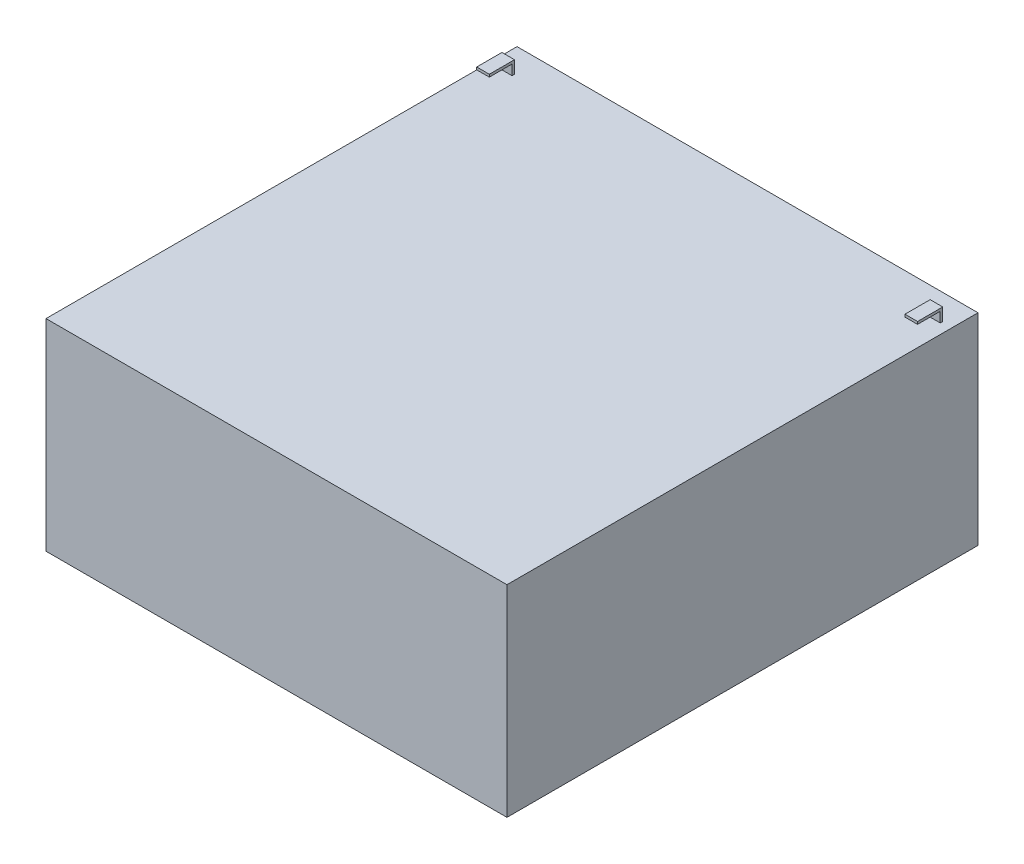
ISO-10303-21;
HEADER;
FILE_DESCRIPTION(('STEP AP214'),'2;1');
FILE_NAME('part.step','',(''),(''),'','','');
FILE_SCHEMA(('AUTOMOTIVE_DESIGN { 1 0 10303 214 1 1 1 1 }'));
ENDSEC;
DATA;
#1=APPLICATION_CONTEXT('core data for automotive mechanical design processes');
#2=APPLICATION_PROTOCOL_DEFINITION('international standard','automotive_design',2000,#1);
#3=PRODUCT_CONTEXT('',#1,'mechanical');
#4=PRODUCT('Part','Part','',(#3));
#5=PRODUCT_RELATED_PRODUCT_CATEGORY('part','',(#4));
#6=PRODUCT_DEFINITION_FORMATION('','',#4);
#7=PRODUCT_DEFINITION_CONTEXT('part definition',#1,'design');
#8=PRODUCT_DEFINITION('design','',#6,#7);
#9=PRODUCT_DEFINITION_SHAPE('','',#8);
#10=(LENGTH_UNIT() NAMED_UNIT(*) SI_UNIT(.MILLI.,.METRE.));
#11=(NAMED_UNIT(*) PLANE_ANGLE_UNIT() SI_UNIT($,.RADIAN.));
#12=(NAMED_UNIT(*) SI_UNIT($,.STERADIAN.) SOLID_ANGLE_UNIT());
#13=UNCERTAINTY_MEASURE_WITH_UNIT(LENGTH_MEASURE(1.E-05),#10,'distance_accuracy_value','');
#14=(GEOMETRIC_REPRESENTATION_CONTEXT(3) GLOBAL_UNCERTAINTY_ASSIGNED_CONTEXT((#13)) GLOBAL_UNIT_ASSIGNED_CONTEXT((#10,
#11,#12)) REPRESENTATION_CONTEXT('',''));
#15=CARTESIAN_POINT('',(0.,0.,0.));
#16=DIRECTION('',(0.,0.,1.));
#17=DIRECTION('',(1.,0.,0.));
#18=AXIS2_PLACEMENT_3D('',#15,#16,#17);
#19=CARTESIAN_POINT('',(0.,80.,-187.));
#20=DIRECTION('',(0.,-1.,0.));
#21=DIRECTION('',(0.,0.,-1.));
#22=AXIS2_PLACEMENT_3D('',#19,#20,#21);
#23=PLANE('',#22);
#24=DIRECTION('',(1.,0.,0.));
#25=VECTOR('',#24,1.);
#26=CARTESIAN_POINT('',(179.,80.,-177.));
#27=LINE('',#26,#25);
#28=CARTESIAN_POINT('',(174.,80.,-177.));
#29=VERTEX_POINT('',#28);
#30=CARTESIAN_POINT('',(179.,80.,-177.));
#31=VERTEX_POINT('',#30);
#32=EDGE_CURVE('E162',#29,#31,#27,.T.);
#33=ORIENTED_EDGE('',*,*,#32,.T.);
#34=DIRECTION('',(0.,0.,1.));
#35=VECTOR('',#34,1.);
#36=CARTESIAN_POINT('',(179.,80.,-177.));
#37=LINE('',#36,#35);
#38=CARTESIAN_POINT('',(179.,80.,-176.));
#39=VERTEX_POINT('',#38);
#40=EDGE_CURVE('E46',#31,#39,#37,.T.);
#41=ORIENTED_EDGE('',*,*,#40,.T.);
#42=DIRECTION('',(-1.,0.,0.));
#43=VECTOR('',#42,1.);
#44=CARTESIAN_POINT('',(179.,80.,-176.));
#45=LINE('',#44,#43);
#46=CARTESIAN_POINT('',(174.,80.,-176.));
#47=VERTEX_POINT('',#46);
#48=EDGE_CURVE('E168',#39,#47,#45,.T.);
#49=ORIENTED_EDGE('',*,*,#48,.T.);
#50=DIRECTION('',(0.,0.,-1.));
#51=VECTOR('',#50,1.);
#52=CARTESIAN_POINT('',(174.,80.,-177.));
#53=LINE('',#52,#51);
#54=EDGE_CURVE('E150',#47,#29,#53,.T.);
#55=ORIENTED_EDGE('',*,*,#54,.T.);
#56=EDGE_LOOP('',(#33,#41,#49,#55));
#57=FACE_BOUND('',#56,.T.);
#58=DIRECTION('',(0.,0.,1.));
#59=VECTOR('',#58,1.);
#60=CARTESIAN_POINT('',(0.,80.,0.));
#61=LINE('',#60,#59);
#62=CARTESIAN_POINT('',(0.,80.,-187.));
#63=VERTEX_POINT('',#62);
#64=CARTESIAN_POINT('',(0.,80.,0.));
#65=VERTEX_POINT('',#64);
#66=EDGE_CURVE('E253',#63,#65,#61,.T.);
#67=ORIENTED_EDGE('',*,*,#66,.T.);
#68=DIRECTION('',(1.,0.,0.));
#69=VECTOR('',#68,1.);
#70=CARTESIAN_POINT('',(0.,80.,0.));
#71=LINE('',#70,#69);
#72=CARTESIAN_POINT('',(183.,80.,0.));
#73=VERTEX_POINT('',#72);
#74=EDGE_CURVE('E256',#65,#73,#71,.T.);
#75=ORIENTED_EDGE('',*,*,#74,.T.);
#76=DIRECTION('',(0.,0.,-1.));
#77=VECTOR('',#76,1.);
#78=CARTESIAN_POINT('',(183.,80.,0.));
#79=LINE('',#78,#77);
#80=CARTESIAN_POINT('',(183.,80.,-187.));
#81=VERTEX_POINT('',#80);
#82=EDGE_CURVE('E258',#73,#81,#79,.T.);
#83=ORIENTED_EDGE('',*,*,#82,.T.);
#84=DIRECTION('',(-1.,0.,0.));
#85=VECTOR('',#84,1.);
#86=CARTESIAN_POINT('',(0.,80.,-187.));
#87=LINE('',#86,#85);
#88=EDGE_CURVE('E260',#81,#63,#87,.T.);
#89=ORIENTED_EDGE('',*,*,#88,.T.);
#90=EDGE_LOOP('',(#67,#75,#83,#89));
#91=FACE_BOUND('',#90,.T.);
#92=DIRECTION('',(-1.,0.,0.));
#93=VECTOR('',#92,1.);
#94=CARTESIAN_POINT('',(4.,80.,-177.));
#95=LINE('',#94,#93);
#96=CARTESIAN_POINT('',(9.,80.,-177.));
#97=VERTEX_POINT('',#96);
#98=CARTESIAN_POINT('',(4.,80.,-177.));
#99=VERTEX_POINT('',#98);
#100=EDGE_CURVE('E54',#97,#99,#95,.T.);
#101=ORIENTED_EDGE('',*,*,#100,.F.);
#102=DIRECTION('',(0.,0.,-1.));
#103=VECTOR('',#102,1.);
#104=CARTESIAN_POINT('',(9.,80.,-177.));
#105=LINE('',#104,#103);
#106=CARTESIAN_POINT('',(9.,80.,-176.));
#107=VERTEX_POINT('',#106);
#108=EDGE_CURVE('E218',#107,#97,#105,.T.);
#109=ORIENTED_EDGE('',*,*,#108,.F.);
#110=DIRECTION('',(1.,0.,0.));
#111=VECTOR('',#110,1.);
#112=CARTESIAN_POINT('',(4.,80.,-176.));
#113=LINE('',#112,#111);
#114=CARTESIAN_POINT('',(4.,80.,-176.));
#115=VERTEX_POINT('',#114);
#116=EDGE_CURVE('E215',#115,#107,#113,.T.);
#117=ORIENTED_EDGE('',*,*,#116,.F.);
#118=DIRECTION('',(0.,0.,1.));
#119=VECTOR('',#118,1.);
#120=CARTESIAN_POINT('',(4.,80.,-177.));
#121=LINE('',#120,#119);
#122=EDGE_CURVE('E192',#99,#115,#121,.T.);
#123=ORIENTED_EDGE('',*,*,#122,.F.);
#124=EDGE_LOOP('',(#101,#109,#117,#123));
#125=FACE_BOUND('',#124,.T.);
#126=ADVANCED_FACE('F31',(#57,#91,#125),#23,.F.);
#127=CARTESIAN_POINT('',(0.,80.,0.));
#128=DIRECTION('',(1.,0.,0.));
#129=DIRECTION('',(0.,0.,-1.));
#130=AXIS2_PLACEMENT_3D('',#127,#128,#129);
#131=PLANE('',#130);
#132=DIRECTION('',(0.,0.,1.));
#133=VECTOR('',#132,1.);
#134=CARTESIAN_POINT('',(0.,0.,0.));
#135=LINE('',#134,#133);
#136=CARTESIAN_POINT('',(0.,0.,-187.));
#137=VERTEX_POINT('',#136);
#138=CARTESIAN_POINT('',(0.,0.,0.));
#139=VERTEX_POINT('',#138);
#140=EDGE_CURVE('E197',#137,#139,#135,.T.);
#141=ORIENTED_EDGE('',*,*,#140,.T.);
#142=DIRECTION('',(0.,-1.,0.));
#143=VECTOR('',#142,1.);
#144=CARTESIAN_POINT('',(0.,80.,0.));
#145=LINE('',#144,#143);
#146=EDGE_CURVE('E12',#65,#139,#145,.T.);
#147=ORIENTED_EDGE('',*,*,#146,.F.);
#148=ORIENTED_EDGE('',*,*,#66,.F.);
#149=DIRECTION('',(0.,-1.,0.));
#150=VECTOR('',#149,1.);
#151=CARTESIAN_POINT('',(0.,80.,-187.));
#152=LINE('',#151,#150);
#153=EDGE_CURVE('E262',#63,#137,#152,.T.);
#154=ORIENTED_EDGE('',*,*,#153,.T.);
#155=EDGE_LOOP('',(#141,#147,#148,#154));
#156=FACE_BOUND('',#155,.T.);
#157=ADVANCED_FACE('F33',(#156),#131,.F.);
#158=CARTESIAN_POINT('',(0.,80.,0.));
#159=DIRECTION('',(0.,0.,-1.));
#160=DIRECTION('',(-1.,0.,0.));
#161=AXIS2_PLACEMENT_3D('',#158,#159,#160);
#162=PLANE('',#161);
#163=DIRECTION('',(1.,0.,0.));
#164=VECTOR('',#163,1.);
#165=CARTESIAN_POINT('',(0.,0.,0.));
#166=LINE('',#165,#164);
#167=CARTESIAN_POINT('',(183.,0.,0.));
#168=VERTEX_POINT('',#167);
#169=EDGE_CURVE('E247',#139,#168,#166,.T.);
#170=ORIENTED_EDGE('',*,*,#169,.T.);
#171=DIRECTION('',(0.,-1.,0.));
#172=VECTOR('',#171,1.);
#173=CARTESIAN_POINT('',(183.,80.,0.));
#174=LINE('',#173,#172);
#175=EDGE_CURVE('E39',#73,#168,#174,.T.);
#176=ORIENTED_EDGE('',*,*,#175,.F.);
#177=ORIENTED_EDGE('',*,*,#74,.F.);
#178=ORIENTED_EDGE('',*,*,#146,.T.);
#179=EDGE_LOOP('',(#170,#176,#177,#178));
#180=FACE_BOUND('',#179,.T.);
#181=ADVANCED_FACE('F286',(#180),#162,.F.);
#182=CARTESIAN_POINT('',(183.,80.,0.));
#183=DIRECTION('',(-1.,0.,0.));
#184=DIRECTION('',(0.,0.,1.));
#185=AXIS2_PLACEMENT_3D('',#182,#183,#184);
#186=PLANE('',#185);
#187=DIRECTION('',(0.,0.,-1.));
#188=VECTOR('',#187,1.);
#189=CARTESIAN_POINT('',(183.,0.,0.));
#190=LINE('',#189,#188);
#191=CARTESIAN_POINT('',(183.,0.,-187.));
#192=VERTEX_POINT('',#191);
#193=EDGE_CURVE('E249',#168,#192,#190,.T.);
#194=ORIENTED_EDGE('',*,*,#193,.T.);
#195=DIRECTION('',(0.,-1.,0.));
#196=VECTOR('',#195,1.);
#197=CARTESIAN_POINT('',(183.,80.,-187.));
#198=LINE('',#197,#196);
#199=EDGE_CURVE('E265',#81,#192,#198,.T.);
#200=ORIENTED_EDGE('',*,*,#199,.F.);
#201=ORIENTED_EDGE('',*,*,#82,.F.);
#202=ORIENTED_EDGE('',*,*,#175,.T.);
#203=EDGE_LOOP('',(#194,#200,#201,#202));
#204=FACE_BOUND('',#203,.T.);
#205=ADVANCED_FACE('F272',(#204),#186,.F.);
#206=CARTESIAN_POINT('',(0.,80.,-187.));
#207=DIRECTION('',(0.,0.,1.));
#208=DIRECTION('',(1.,0.,0.));
#209=AXIS2_PLACEMENT_3D('',#206,#207,#208);
#210=PLANE('',#209);
#211=DIRECTION('',(-1.,0.,0.));
#212=VECTOR('',#211,1.);
#213=CARTESIAN_POINT('',(0.,0.,-187.));
#214=LINE('',#213,#212);
#215=EDGE_CURVE('E251',#192,#137,#214,.T.);
#216=ORIENTED_EDGE('',*,*,#215,.T.);
#217=ORIENTED_EDGE('',*,*,#153,.F.);
#218=ORIENTED_EDGE('',*,*,#88,.F.);
#219=ORIENTED_EDGE('',*,*,#199,.T.);
#220=EDGE_LOOP('',(#216,#217,#218,#219));
#221=FACE_BOUND('',#220,.T.);
#222=ADVANCED_FACE('F281',(#221),#210,.F.);
#223=CARTESIAN_POINT('',(0.,0.,-187.));
#224=DIRECTION('',(0.,-1.,0.));
#225=DIRECTION('',(0.,0.,-1.));
#226=AXIS2_PLACEMENT_3D('',#223,#224,#225);
#227=PLANE('',#226);
#228=ORIENTED_EDGE('',*,*,#140,.F.);
#229=ORIENTED_EDGE('',*,*,#215,.F.);
#230=ORIENTED_EDGE('',*,*,#193,.F.);
#231=ORIENTED_EDGE('',*,*,#169,.F.);
#232=EDGE_LOOP('',(#228,#229,#230,#231));
#233=FACE_BOUND('',#232,.T.);
#234=ADVANCED_FACE('F278',(#233),#227,.T.);
#235=CARTESIAN_POINT('',(4.,85.,-177.));
#236=DIRECTION('',(0.,1.,0.));
#237=DIRECTION('',(0.,0.,1.));
#238=AXIS2_PLACEMENT_3D('',#235,#236,#237);
#239=PLANE('',#238);
#240=DIRECTION('',(0.,0.,1.));
#241=VECTOR('',#240,1.);
#242=CARTESIAN_POINT('',(4.,85.,-177.));
#243=LINE('',#242,#241);
#244=CARTESIAN_POINT('',(4.,85.,-177.));
#245=VERTEX_POINT('',#244);
#246=CARTESIAN_POINT('',(4.,85.,-167.));
#247=VERTEX_POINT('',#246);
#248=EDGE_CURVE('E240',#245,#247,#243,.T.);
#249=ORIENTED_EDGE('',*,*,#248,.T.);
#250=DIRECTION('',(1.,0.,0.));
#251=VECTOR('',#250,1.);
#252=CARTESIAN_POINT('',(4.,85.,-167.));
#253=LINE('',#252,#251);
#254=CARTESIAN_POINT('',(9.,85.,-167.));
#255=VERTEX_POINT('',#254);
#256=EDGE_CURVE('E201',#247,#255,#253,.T.);
#257=ORIENTED_EDGE('',*,*,#256,.T.);
#258=DIRECTION('',(0.,0.,1.));
#259=VECTOR('',#258,1.);
#260=CARTESIAN_POINT('',(9.,85.,-177.));
#261=LINE('',#260,#259);
#262=CARTESIAN_POINT('',(9.,85.,-177.));
#263=VERTEX_POINT('',#262);
#264=EDGE_CURVE('E212',#263,#255,#261,.T.);
#265=ORIENTED_EDGE('',*,*,#264,.F.);
#266=DIRECTION('',(-1.,0.,0.));
#267=VECTOR('',#266,1.);
#268=CARTESIAN_POINT('',(4.,85.,-177.));
#269=LINE('',#268,#267);
#270=EDGE_CURVE('E208',#263,#245,#269,.T.);
#271=ORIENTED_EDGE('',*,*,#270,.T.);
#272=EDGE_LOOP('',(#249,#257,#265,#271));
#273=FACE_BOUND('',#272,.T.);
#274=ADVANCED_FACE('F306',(#273),#239,.T.);
#275=CARTESIAN_POINT('',(4.,84.,-176.));
#276=DIRECTION('',(0.,-1.,0.));
#277=DIRECTION('',(0.,0.,-1.));
#278=AXIS2_PLACEMENT_3D('',#275,#276,#277);
#279=PLANE('',#278);
#280=DIRECTION('',(0.,0.,1.));
#281=VECTOR('',#280,1.);
#282=CARTESIAN_POINT('',(9.,84.,-176.));
#283=LINE('',#282,#281);
#284=CARTESIAN_POINT('',(9.,84.,-176.));
#285=VERTEX_POINT('',#284);
#286=CARTESIAN_POINT('',(9.,84.,-167.));
#287=VERTEX_POINT('',#286);
#288=EDGE_CURVE('E234',#285,#287,#283,.T.);
#289=ORIENTED_EDGE('',*,*,#288,.T.);
#290=DIRECTION('',(-1.,0.,0.));
#291=VECTOR('',#290,1.);
#292=CARTESIAN_POINT('',(4.,84.,-167.));
#293=LINE('',#292,#291);
#294=CARTESIAN_POINT('',(4.,84.,-167.));
#295=VERTEX_POINT('',#294);
#296=EDGE_CURVE('E194',#287,#295,#293,.T.);
#297=ORIENTED_EDGE('',*,*,#296,.T.);
#298=DIRECTION('',(0.,0.,1.));
#299=VECTOR('',#298,1.);
#300=CARTESIAN_POINT('',(4.,84.,-176.));
#301=LINE('',#300,#299);
#302=CARTESIAN_POINT('',(4.,84.,-176.));
#303=VERTEX_POINT('',#302);
#304=EDGE_CURVE('E237',#303,#295,#301,.T.);
#305=ORIENTED_EDGE('',*,*,#304,.F.);
#306=DIRECTION('',(1.,0.,0.));
#307=VECTOR('',#306,1.);
#308=CARTESIAN_POINT('',(4.,84.,-176.));
#309=LINE('',#308,#307);
#310=EDGE_CURVE('E205',#303,#285,#309,.T.);
#311=ORIENTED_EDGE('',*,*,#310,.T.);
#312=EDGE_LOOP('',(#289,#297,#305,#311));
#313=FACE_BOUND('',#312,.T.);
#314=ADVANCED_FACE('F310',(#313),#279,.T.);
#315=CARTESIAN_POINT('',(4.,89.5990195135928,-177.));
#316=DIRECTION('',(0.,0.,1.));
#317=DIRECTION('',(1.,0.,0.));
#318=AXIS2_PLACEMENT_3D('',#315,#316,#317);
#319=PLANE('',#318);
#320=ORIENTED_EDGE('',*,*,#270,.F.);
#321=DIRECTION('',(0.,-1.,0.));
#322=VECTOR('',#321,1.);
#323=CARTESIAN_POINT('',(9.,89.5990195135928,-177.));
#324=LINE('',#323,#322);
#325=EDGE_CURVE('E225',#263,#97,#324,.T.);
#326=ORIENTED_EDGE('',*,*,#325,.T.);
#327=ORIENTED_EDGE('',*,*,#100,.T.);
#328=DIRECTION('',(0.,-1.,0.));
#329=VECTOR('',#328,1.);
#330=CARTESIAN_POINT('',(4.,89.5990195135928,-177.));
#331=LINE('',#330,#329);
#332=EDGE_CURVE('E222',#245,#99,#331,.T.);
#333=ORIENTED_EDGE('',*,*,#332,.F.);
#334=EDGE_LOOP('',(#320,#326,#327,#333));
#335=FACE_BOUND('',#334,.T.);
#336=ADVANCED_FACE('F316',(#335),#319,.F.);
#337=CARTESIAN_POINT('',(9.,89.5990195135928,-177.));
#338=DIRECTION('',(-1.,0.,0.));
#339=DIRECTION('',(0.,0.,1.));
#340=AXIS2_PLACEMENT_3D('',#337,#338,#339);
#341=PLANE('',#340);
#342=ORIENTED_EDGE('',*,*,#325,.F.);
#343=ORIENTED_EDGE('',*,*,#264,.T.);
#344=DIRECTION('',(0.,-1.,0.));
#345=VECTOR('',#344,1.);
#346=CARTESIAN_POINT('',(9.,87.2995097567964,-167.));
#347=LINE('',#346,#345);
#348=EDGE_CURVE('E198',#255,#287,#347,.T.);
#349=ORIENTED_EDGE('',*,*,#348,.T.);
#350=ORIENTED_EDGE('',*,*,#288,.F.);
#351=DIRECTION('',(0.,-1.,0.));
#352=VECTOR('',#351,1.);
#353=CARTESIAN_POINT('',(9.,89.5990195135928,-176.));
#354=LINE('',#353,#352);
#355=EDGE_CURVE('E227',#285,#107,#354,.T.);
#356=ORIENTED_EDGE('',*,*,#355,.T.);
#357=ORIENTED_EDGE('',*,*,#108,.T.);
#358=EDGE_LOOP('',(#342,#343,#349,#350,#356,#357));
#359=FACE_BOUND('',#358,.T.);
#360=ADVANCED_FACE('F327',(#359),#341,.F.);
#361=CARTESIAN_POINT('',(4.,89.5990195135928,-176.));
#362=DIRECTION('',(0.,0.,-1.));
#363=DIRECTION('',(-1.,0.,0.));
#364=AXIS2_PLACEMENT_3D('',#361,#362,#363);
#365=PLANE('',#364);
#366=ORIENTED_EDGE('',*,*,#310,.F.);
#367=DIRECTION('',(0.,-1.,0.));
#368=VECTOR('',#367,1.);
#369=CARTESIAN_POINT('',(4.,89.5990195135928,-176.));
#370=LINE('',#369,#368);
#371=EDGE_CURVE('E209',#303,#115,#370,.T.);
#372=ORIENTED_EDGE('',*,*,#371,.T.);
#373=ORIENTED_EDGE('',*,*,#116,.T.);
#374=ORIENTED_EDGE('',*,*,#355,.F.);
#375=EDGE_LOOP('',(#366,#372,#373,#374));
#376=FACE_BOUND('',#375,.T.);
#377=ADVANCED_FACE('F323',(#376),#365,.F.);
#378=CARTESIAN_POINT('',(4.,89.5990195135928,-177.));
#379=DIRECTION('',(1.,0.,0.));
#380=DIRECTION('',(0.,0.,-1.));
#381=AXIS2_PLACEMENT_3D('',#378,#379,#380);
#382=PLANE('',#381);
#383=ORIENTED_EDGE('',*,*,#371,.F.);
#384=ORIENTED_EDGE('',*,*,#304,.T.);
#385=DIRECTION('',(0.,1.,0.));
#386=VECTOR('',#385,1.);
#387=CARTESIAN_POINT('',(4.,87.2995097567964,-167.));
#388=LINE('',#387,#386);
#389=EDGE_CURVE('E204',#295,#247,#388,.T.);
#390=ORIENTED_EDGE('',*,*,#389,.T.);
#391=ORIENTED_EDGE('',*,*,#248,.F.);
#392=ORIENTED_EDGE('',*,*,#332,.T.);
#393=ORIENTED_EDGE('',*,*,#122,.T.);
#394=EDGE_LOOP('',(#383,#384,#390,#391,#392,#393));
#395=FACE_BOUND('',#394,.T.);
#396=ADVANCED_FACE('F319',(#395),#382,.F.);
#397=CARTESIAN_POINT('',(6.5,84.5,-167.));
#398=DIRECTION('',(0.,0.,1.));
#399=DIRECTION('',(0.,-1.,0.));
#400=AXIS2_PLACEMENT_3D('',#397,#398,#399);
#401=PLANE('',#400);
#402=ORIENTED_EDGE('',*,*,#389,.F.);
#403=ORIENTED_EDGE('',*,*,#296,.F.);
#404=ORIENTED_EDGE('',*,*,#348,.F.);
#405=ORIENTED_EDGE('',*,*,#256,.F.);
#406=EDGE_LOOP('',(#402,#403,#404,#405));
#407=FACE_BOUND('',#406,.T.);
#408=ADVANCED_FACE('F322',(#407),#401,.T.);
#409=CARTESIAN_POINT('',(179.,85.,-177.));
#410=DIRECTION('',(0.,-1.,0.));
#411=DIRECTION('',(0.,0.,-1.));
#412=AXIS2_PLACEMENT_3D('',#409,#410,#411);
#413=PLANE('',#412);
#414=DIRECTION('',(-1.,0.,0.));
#415=VECTOR('',#414,1.);
#416=CARTESIAN_POINT('',(179.,85.,-167.));
#417=LINE('',#416,#415);
#418=CARTESIAN_POINT('',(179.,85.,-167.));
#419=VERTEX_POINT('',#418);
#420=CARTESIAN_POINT('',(174.,85.,-167.));
#421=VERTEX_POINT('',#420);
#422=EDGE_CURVE('E363',#419,#421,#417,.T.);
#423=ORIENTED_EDGE('',*,*,#422,.F.);
#424=DIRECTION('',(0.,0.,1.));
#425=VECTOR('',#424,1.);
#426=CARTESIAN_POINT('',(179.,85.,-177.));
#427=LINE('',#426,#425);
#428=CARTESIAN_POINT('',(179.,85.,-177.));
#429=VERTEX_POINT('',#428);
#430=EDGE_CURVE('E179',#429,#419,#427,.T.);
#431=ORIENTED_EDGE('',*,*,#430,.F.);
#432=DIRECTION('',(1.,0.,0.));
#433=VECTOR('',#432,1.);
#434=CARTESIAN_POINT('',(179.,85.,-177.));
#435=LINE('',#434,#433);
#436=CARTESIAN_POINT('',(174.,85.,-177.));
#437=VERTEX_POINT('',#436);
#438=EDGE_CURVE('E180',#437,#429,#435,.T.);
#439=ORIENTED_EDGE('',*,*,#438,.F.);
#440=DIRECTION('',(0.,0.,1.));
#441=VECTOR('',#440,1.);
#442=CARTESIAN_POINT('',(174.,85.,-177.));
#443=LINE('',#442,#441);
#444=EDGE_CURVE('E154',#437,#421,#443,.T.);
#445=ORIENTED_EDGE('',*,*,#444,.T.);
#446=EDGE_LOOP('',(#423,#431,#439,#445));
#447=FACE_BOUND('',#446,.T.);
#448=ADVANCED_FACE('F336',(#447),#413,.F.);
#449=CARTESIAN_POINT('',(179.,84.,-176.));
#450=DIRECTION('',(0.,1.,0.));
#451=DIRECTION('',(0.,0.,1.));
#452=AXIS2_PLACEMENT_3D('',#449,#450,#451);
#453=PLANE('',#452);
#454=DIRECTION('',(1.,0.,0.));
#455=VECTOR('',#454,1.);
#456=CARTESIAN_POINT('',(179.,84.,-167.));
#457=LINE('',#456,#455);
#458=CARTESIAN_POINT('',(174.,84.,-167.));
#459=VERTEX_POINT('',#458);
#460=CARTESIAN_POINT('',(179.,84.,-167.));
#461=VERTEX_POINT('',#460);
#462=EDGE_CURVE('E190',#459,#461,#457,.T.);
#463=ORIENTED_EDGE('',*,*,#462,.F.);
#464=DIRECTION('',(0.,0.,1.));
#465=VECTOR('',#464,1.);
#466=CARTESIAN_POINT('',(174.,84.,-176.));
#467=LINE('',#466,#465);
#468=CARTESIAN_POINT('',(174.,84.,-176.));
#469=VERTEX_POINT('',#468);
#470=EDGE_CURVE('E186',#469,#459,#467,.T.);
#471=ORIENTED_EDGE('',*,*,#470,.F.);
#472=DIRECTION('',(-1.,0.,0.));
#473=VECTOR('',#472,1.);
#474=CARTESIAN_POINT('',(179.,84.,-176.));
#475=LINE('',#474,#473);
#476=CARTESIAN_POINT('',(179.,84.,-176.));
#477=VERTEX_POINT('',#476);
#478=EDGE_CURVE('E177',#477,#469,#475,.T.);
#479=ORIENTED_EDGE('',*,*,#478,.F.);
#480=DIRECTION('',(0.,0.,1.));
#481=VECTOR('',#480,1.);
#482=CARTESIAN_POINT('',(179.,84.,-176.));
#483=LINE('',#482,#481);
#484=EDGE_CURVE('E183',#477,#461,#483,.T.);
#485=ORIENTED_EDGE('',*,*,#484,.T.);
#486=EDGE_LOOP('',(#463,#471,#479,#485));
#487=FACE_BOUND('',#486,.T.);
#488=ADVANCED_FACE('F338',(#487),#453,.F.);
#489=CARTESIAN_POINT('',(179.,89.5990195135928,-177.));
#490=DIRECTION('',(1.,0.,0.));
#491=DIRECTION('',(0.,0.,-1.));
#492=AXIS2_PLACEMENT_3D('',#489,#490,#491);
#493=PLANE('',#492);
#494=DIRECTION('',(0.,-1.,0.));
#495=VECTOR('',#494,1.);
#496=CARTESIAN_POINT('',(179.,89.5990195135928,-177.));
#497=LINE('',#496,#495);
#498=EDGE_CURVE('E158',#429,#31,#497,.T.);
#499=ORIENTED_EDGE('',*,*,#498,.F.);
#500=ORIENTED_EDGE('',*,*,#430,.T.);
#501=DIRECTION('',(0.,1.,0.));
#502=VECTOR('',#501,1.);
#503=CARTESIAN_POINT('',(179.,87.2995097567964,-167.));
#504=LINE('',#503,#502);
#505=EDGE_CURVE('E189',#461,#419,#504,.T.);
#506=ORIENTED_EDGE('',*,*,#505,.F.);
#507=ORIENTED_EDGE('',*,*,#484,.F.);
#508=DIRECTION('',(0.,-1.,0.));
#509=VECTOR('',#508,1.);
#510=CARTESIAN_POINT('',(179.,89.5990195135928,-176.));
#511=LINE('',#510,#509);
#512=EDGE_CURVE('E170',#477,#39,#511,.T.);
#513=ORIENTED_EDGE('',*,*,#512,.T.);
#514=ORIENTED_EDGE('',*,*,#40,.F.);
#515=EDGE_LOOP('',(#499,#500,#506,#507,#513,#514));
#516=FACE_BOUND('',#515,.T.);
#517=ADVANCED_FACE('F341',(#516),#493,.T.);
#518=CARTESIAN_POINT('',(179.,89.5990195135928,-176.));
#519=DIRECTION('',(0.,0.,1.));
#520=DIRECTION('',(1.,0.,0.));
#521=AXIS2_PLACEMENT_3D('',#518,#519,#520);
#522=PLANE('',#521);
#523=ORIENTED_EDGE('',*,*,#512,.F.);
#524=ORIENTED_EDGE('',*,*,#478,.T.);
#525=DIRECTION('',(0.,-1.,0.));
#526=VECTOR('',#525,1.);
#527=CARTESIAN_POINT('',(174.,89.5990195135928,-176.));
#528=LINE('',#527,#526);
#529=EDGE_CURVE('E159',#469,#47,#528,.T.);
#530=ORIENTED_EDGE('',*,*,#529,.T.);
#531=ORIENTED_EDGE('',*,*,#48,.F.);
#532=EDGE_LOOP('',(#523,#524,#530,#531));
#533=FACE_BOUND('',#532,.T.);
#534=ADVANCED_FACE('F347',(#533),#522,.T.);
#535=CARTESIAN_POINT('',(174.,89.5990195135928,-177.));
#536=DIRECTION('',(-1.,0.,0.));
#537=DIRECTION('',(0.,0.,1.));
#538=AXIS2_PLACEMENT_3D('',#535,#536,#537);
#539=PLANE('',#538);
#540=ORIENTED_EDGE('',*,*,#529,.F.);
#541=ORIENTED_EDGE('',*,*,#470,.T.);
#542=DIRECTION('',(0.,-1.,0.));
#543=VECTOR('',#542,1.);
#544=CARTESIAN_POINT('',(174.,87.2995097567964,-167.));
#545=LINE('',#544,#543);
#546=EDGE_CURVE('E193',#421,#459,#545,.T.);
#547=ORIENTED_EDGE('',*,*,#546,.F.);
#548=ORIENTED_EDGE('',*,*,#444,.F.);
#549=DIRECTION('',(0.,-1.,0.));
#550=VECTOR('',#549,1.);
#551=CARTESIAN_POINT('',(174.,89.5990195135928,-177.));
#552=LINE('',#551,#550);
#553=EDGE_CURVE('E145',#437,#29,#552,.T.);
#554=ORIENTED_EDGE('',*,*,#553,.T.);
#555=ORIENTED_EDGE('',*,*,#54,.F.);
#556=EDGE_LOOP('',(#540,#541,#547,#548,#554,#555));
#557=FACE_BOUND('',#556,.T.);
#558=ADVANCED_FACE('F148',(#557),#539,.T.);
#559=CARTESIAN_POINT('',(179.,89.5990195135928,-177.));
#560=DIRECTION('',(0.,0.,-1.));
#561=DIRECTION('',(-1.,0.,0.));
#562=AXIS2_PLACEMENT_3D('',#559,#560,#561);
#563=PLANE('',#562);
#564=ORIENTED_EDGE('',*,*,#553,.F.);
#565=ORIENTED_EDGE('',*,*,#438,.T.);
#566=ORIENTED_EDGE('',*,*,#498,.T.);
#567=ORIENTED_EDGE('',*,*,#32,.F.);
#568=EDGE_LOOP('',(#564,#565,#566,#567));
#569=FACE_BOUND('',#568,.T.);
#570=ADVANCED_FACE('F163',(#569),#563,.T.);
#571=CARTESIAN_POINT('',(176.5,84.5,-167.));
#572=DIRECTION('',(0.,0.,1.));
#573=DIRECTION('',(0.,-1.,0.));
#574=AXIS2_PLACEMENT_3D('',#571,#572,#573);
#575=PLANE('',#574);
#576=ORIENTED_EDGE('',*,*,#546,.T.);
#577=ORIENTED_EDGE('',*,*,#462,.T.);
#578=ORIENTED_EDGE('',*,*,#505,.T.);
#579=ORIENTED_EDGE('',*,*,#422,.T.);
#580=EDGE_LOOP('',(#576,#577,#578,#579));
#581=FACE_BOUND('',#580,.T.);
#582=ADVANCED_FACE('F350',(#581),#575,.T.);
#583=CLOSED_SHELL('',(#126,#157,#181,#205,#222,#234,#274,#314,#336,#360,#377,#396,#408,#448,
#488,#517,#534,#558,#570,#582));
#584=MANIFOLD_SOLID_BREP('B2',#583);
#585=ADVANCED_BREP_SHAPE_REPRESENTATION('',(#18,#584),#14);
#586=SHAPE_DEFINITION_REPRESENTATION(#9,#585);
ENDSEC;
END-ISO-10303-21;
